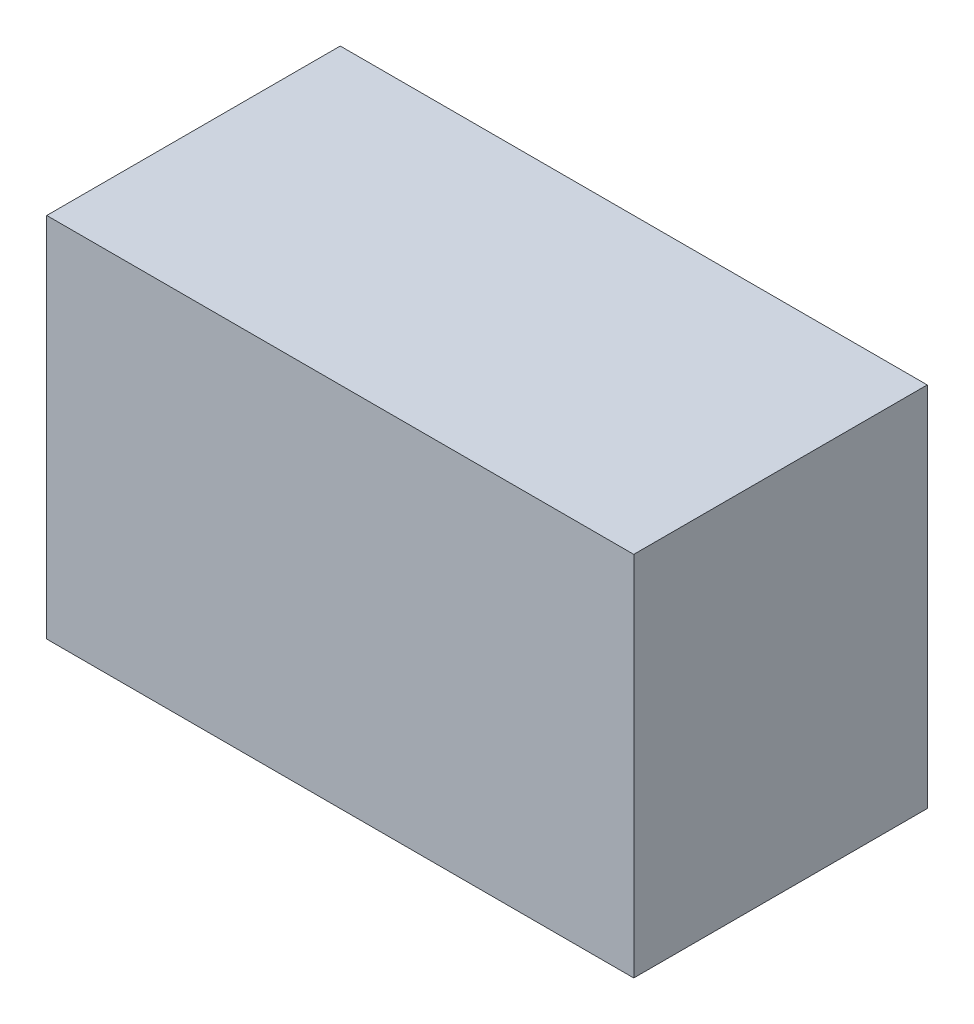
ISO-10303-21;
HEADER;
FILE_DESCRIPTION(('STEP AP214'),'2;1');
FILE_NAME('part.step','',(''),(''),'','','');
FILE_SCHEMA(('AUTOMOTIVE_DESIGN { 1 0 10303 214 1 1 1 1 }'));
ENDSEC;
DATA;
#1=APPLICATION_CONTEXT('core data for automotive mechanical design processes');
#2=APPLICATION_PROTOCOL_DEFINITION('international standard','automotive_design',2000,#1);
#3=PRODUCT_CONTEXT('',#1,'mechanical');
#4=PRODUCT('Part','Part','',(#3));
#5=PRODUCT_RELATED_PRODUCT_CATEGORY('part','',(#4));
#6=PRODUCT_DEFINITION_FORMATION('','',#4);
#7=PRODUCT_DEFINITION_CONTEXT('part definition',#1,'design');
#8=PRODUCT_DEFINITION('design','',#6,#7);
#9=PRODUCT_DEFINITION_SHAPE('','',#8);
#10=(LENGTH_UNIT() NAMED_UNIT(*) SI_UNIT(.MILLI.,.METRE.));
#11=(NAMED_UNIT(*) PLANE_ANGLE_UNIT() SI_UNIT($,.RADIAN.));
#12=(NAMED_UNIT(*) SI_UNIT($,.STERADIAN.) SOLID_ANGLE_UNIT());
#13=UNCERTAINTY_MEASURE_WITH_UNIT(LENGTH_MEASURE(1.E-05),#10,'distance_accuracy_value','');
#14=(GEOMETRIC_REPRESENTATION_CONTEXT(3) GLOBAL_UNCERTAINTY_ASSIGNED_CONTEXT((#13)) GLOBAL_UNIT_ASSIGNED_CONTEXT((#10,
#11,#12)) REPRESENTATION_CONTEXT('',''));
#15=CARTESIAN_POINT('',(0.,0.,0.));
#16=DIRECTION('',(0.,0.,1.));
#17=DIRECTION('',(1.,0.,0.));
#18=AXIS2_PLACEMENT_3D('',#15,#16,#17);
#19=CARTESIAN_POINT('',(0.,1270.,0.));
#20=DIRECTION('',(1.,0.,0.));
#21=DIRECTION('',(0.,0.,-1.));
#22=AXIS2_PLACEMENT_3D('',#19,#20,#21);
#23=PLANE('',#22);
#24=DIRECTION('',(0.,0.,1.));
#25=VECTOR('',#24,1.);
#26=CARTESIAN_POINT('',(0.,0.,0.));
#27=LINE('',#26,#25);
#28=CARTESIAN_POINT('',(0.,0.,-1016.));
#29=VERTEX_POINT('',#28);
#30=CARTESIAN_POINT('',(0.,0.,0.));
#31=VERTEX_POINT('',#30);
#32=EDGE_CURVE('E94',#29,#31,#27,.T.);
#33=ORIENTED_EDGE('',*,*,#32,.T.);
#34=DIRECTION('',(0.,-1.,0.));
#35=VECTOR('',#34,1.);
#36=CARTESIAN_POINT('',(0.,1270.,0.));
#37=LINE('',#36,#35);
#38=CARTESIAN_POINT('',(0.,1270.,0.));
#39=VERTEX_POINT('',#38);
#40=EDGE_CURVE('E11',#39,#31,#37,.T.);
#41=ORIENTED_EDGE('',*,*,#40,.F.);
#42=DIRECTION('',(0.,0.,1.));
#43=VECTOR('',#42,1.);
#44=CARTESIAN_POINT('',(0.,1270.,0.));
#45=LINE('',#44,#43);
#46=CARTESIAN_POINT('',(0.,1270.,-1016.));
#47=VERTEX_POINT('',#46);
#48=EDGE_CURVE('E82',#47,#39,#45,.T.);
#49=ORIENTED_EDGE('',*,*,#48,.F.);
#50=DIRECTION('',(0.,-1.,0.));
#51=VECTOR('',#50,1.);
#52=CARTESIAN_POINT('',(0.,1270.,-1016.));
#53=LINE('',#52,#51);
#54=EDGE_CURVE('E90',#47,#29,#53,.T.);
#55=ORIENTED_EDGE('',*,*,#54,.T.);
#56=EDGE_LOOP('',(#33,#41,#49,#55));
#57=FACE_BOUND('',#56,.T.);
#58=ADVANCED_FACE('F31',(#57),#23,.F.);
#59=CARTESIAN_POINT('',(0.,1270.,0.));
#60=DIRECTION('',(0.,0.,-1.));
#61=DIRECTION('',(-1.,0.,0.));
#62=AXIS2_PLACEMENT_3D('',#59,#60,#61);
#63=PLANE('',#62);
#64=DIRECTION('',(1.,0.,0.));
#65=VECTOR('',#64,1.);
#66=CARTESIAN_POINT('',(0.,0.,0.));
#67=LINE('',#66,#65);
#68=CARTESIAN_POINT('',(2032.,0.,0.));
#69=VERTEX_POINT('',#68);
#70=EDGE_CURVE('E86',#31,#69,#67,.T.);
#71=ORIENTED_EDGE('',*,*,#70,.T.);
#72=DIRECTION('',(0.,-1.,0.));
#73=VECTOR('',#72,1.);
#74=CARTESIAN_POINT('',(2032.,1270.,0.));
#75=LINE('',#74,#73);
#76=CARTESIAN_POINT('',(2032.,1270.,0.));
#77=VERTEX_POINT('',#76);
#78=EDGE_CURVE('E39',#77,#69,#75,.T.);
#79=ORIENTED_EDGE('',*,*,#78,.F.);
#80=DIRECTION('',(1.,0.,0.));
#81=VECTOR('',#80,1.);
#82=CARTESIAN_POINT('',(0.,1270.,0.));
#83=LINE('',#82,#81);
#84=EDGE_CURVE('E77',#39,#77,#83,.T.);
#85=ORIENTED_EDGE('',*,*,#84,.F.);
#86=ORIENTED_EDGE('',*,*,#40,.T.);
#87=EDGE_LOOP('',(#71,#79,#85,#86));
#88=FACE_BOUND('',#87,.T.);
#89=ADVANCED_FACE('F85',(#88),#63,.F.);
#90=CARTESIAN_POINT('',(2032.,1270.,0.));
#91=DIRECTION('',(-1.,0.,0.));
#92=DIRECTION('',(0.,0.,1.));
#93=AXIS2_PLACEMENT_3D('',#90,#91,#92);
#94=PLANE('',#93);
#95=DIRECTION('',(0.,0.,-1.));
#96=VECTOR('',#95,1.);
#97=CARTESIAN_POINT('',(2032.,0.,0.));
#98=LINE('',#97,#96);
#99=CARTESIAN_POINT('',(2032.,0.,-1016.));
#100=VERTEX_POINT('',#99);
#101=EDGE_CURVE('E64',#69,#100,#98,.T.);
#102=ORIENTED_EDGE('',*,*,#101,.T.);
#103=DIRECTION('',(0.,-1.,0.));
#104=VECTOR('',#103,1.);
#105=CARTESIAN_POINT('',(2032.,1270.,-1016.));
#106=LINE('',#105,#104);
#107=CARTESIAN_POINT('',(2032.,1270.,-1016.));
#108=VERTEX_POINT('',#107);
#109=EDGE_CURVE('E87',#108,#100,#106,.T.);
#110=ORIENTED_EDGE('',*,*,#109,.F.);
#111=DIRECTION('',(0.,0.,-1.));
#112=VECTOR('',#111,1.);
#113=CARTESIAN_POINT('',(2032.,1270.,0.));
#114=LINE('',#113,#112);
#115=EDGE_CURVE('E80',#77,#108,#114,.T.);
#116=ORIENTED_EDGE('',*,*,#115,.F.);
#117=ORIENTED_EDGE('',*,*,#78,.T.);
#118=EDGE_LOOP('',(#102,#110,#116,#117));
#119=FACE_BOUND('',#118,.T.);
#120=ADVANCED_FACE('F88',(#119),#94,.F.);
#121=CARTESIAN_POINT('',(0.,1270.,-1016.));
#122=DIRECTION('',(0.,0.,1.));
#123=DIRECTION('',(1.,0.,0.));
#124=AXIS2_PLACEMENT_3D('',#121,#122,#123);
#125=PLANE('',#124);
#126=DIRECTION('',(-1.,0.,0.));
#127=VECTOR('',#126,1.);
#128=CARTESIAN_POINT('',(0.,0.,-1016.));
#129=LINE('',#128,#127);
#130=EDGE_CURVE('E70',#100,#29,#129,.T.);
#131=ORIENTED_EDGE('',*,*,#130,.T.);
#132=ORIENTED_EDGE('',*,*,#54,.F.);
#133=DIRECTION('',(-1.,0.,0.));
#134=VECTOR('',#133,1.);
#135=CARTESIAN_POINT('',(0.,1270.,-1016.));
#136=LINE('',#135,#134);
#137=EDGE_CURVE('E47',#108,#47,#136,.T.);
#138=ORIENTED_EDGE('',*,*,#137,.F.);
#139=ORIENTED_EDGE('',*,*,#109,.T.);
#140=EDGE_LOOP('',(#131,#132,#138,#139));
#141=FACE_BOUND('',#140,.T.);
#142=ADVANCED_FACE('F101',(#141),#125,.F.);
#143=CARTESIAN_POINT('',(0.,1270.,-1016.));
#144=DIRECTION('',(0.,-1.,0.));
#145=DIRECTION('',(0.,0.,-1.));
#146=AXIS2_PLACEMENT_3D('',#143,#144,#145);
#147=PLANE('',#146);
#148=ORIENTED_EDGE('',*,*,#48,.T.);
#149=ORIENTED_EDGE('',*,*,#84,.T.);
#150=ORIENTED_EDGE('',*,*,#115,.T.);
#151=ORIENTED_EDGE('',*,*,#137,.T.);
#152=EDGE_LOOP('',(#148,#149,#150,#151));
#153=FACE_BOUND('',#152,.T.);
#154=ADVANCED_FACE('F78',(#153),#147,.F.);
#155=CARTESIAN_POINT('',(0.,0.,-1016.));
#156=DIRECTION('',(0.,-1.,0.));
#157=DIRECTION('',(0.,0.,-1.));
#158=AXIS2_PLACEMENT_3D('',#155,#156,#157);
#159=PLANE('',#158);
#160=ORIENTED_EDGE('',*,*,#32,.F.);
#161=ORIENTED_EDGE('',*,*,#130,.F.);
#162=ORIENTED_EDGE('',*,*,#101,.F.);
#163=ORIENTED_EDGE('',*,*,#70,.F.);
#164=EDGE_LOOP('',(#160,#161,#162,#163));
#165=FACE_BOUND('',#164,.T.);
#166=ADVANCED_FACE('F104',(#165),#159,.T.);
#167=CLOSED_SHELL('',(#58,#89,#120,#142,#154,#166));
#168=MANIFOLD_SOLID_BREP('B2',#167);
#169=ADVANCED_BREP_SHAPE_REPRESENTATION('',(#18,#168),#14);
#170=SHAPE_DEFINITION_REPRESENTATION(#9,#169);
ENDSEC;
END-ISO-10303-21;
